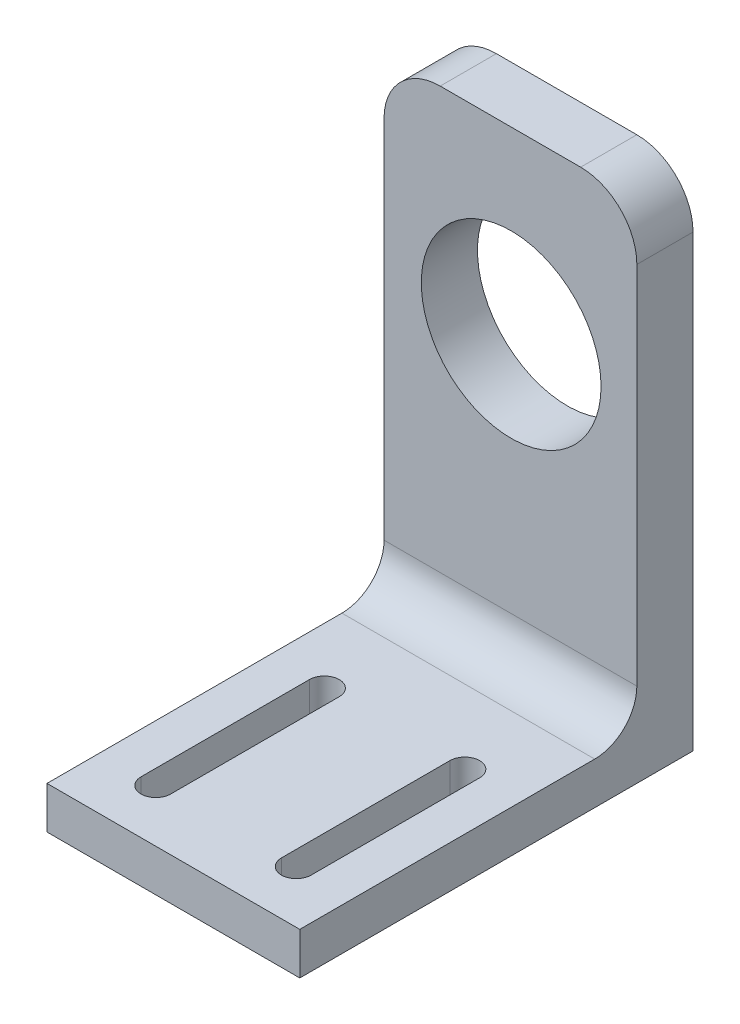
ISO-10303-21;
HEADER;
FILE_DESCRIPTION(('STEP AP214'),'2;1');
FILE_NAME('part.step','',(''),(''),'','','');
FILE_SCHEMA(('AUTOMOTIVE_DESIGN { 1 0 10303 214 1 1 1 1 }'));
ENDSEC;
DATA;
#1=APPLICATION_CONTEXT('core data for automotive mechanical design processes');
#2=APPLICATION_PROTOCOL_DEFINITION('international standard','automotive_design',2000,#1);
#3=PRODUCT_CONTEXT('',#1,'mechanical');
#4=PRODUCT('Part','Part','',(#3));
#5=PRODUCT_RELATED_PRODUCT_CATEGORY('part','',(#4));
#6=PRODUCT_DEFINITION_FORMATION('','',#4);
#7=PRODUCT_DEFINITION_CONTEXT('part definition',#1,'design');
#8=PRODUCT_DEFINITION('design','',#6,#7);
#9=PRODUCT_DEFINITION_SHAPE('','',#8);
#10=(LENGTH_UNIT() NAMED_UNIT(*) SI_UNIT(.MILLI.,.METRE.));
#11=(NAMED_UNIT(*) PLANE_ANGLE_UNIT() SI_UNIT($,.RADIAN.));
#12=(NAMED_UNIT(*) SI_UNIT($,.STERADIAN.) SOLID_ANGLE_UNIT());
#13=UNCERTAINTY_MEASURE_WITH_UNIT(LENGTH_MEASURE(1.E-05),#10,'distance_accuracy_value','');
#14=(GEOMETRIC_REPRESENTATION_CONTEXT(3) GLOBAL_UNCERTAINTY_ASSIGNED_CONTEXT((#13)) GLOBAL_UNIT_ASSIGNED_CONTEXT((#10,
#11,#12)) REPRESENTATION_CONTEXT('',''));
#15=CARTESIAN_POINT('',(0.,0.,0.));
#16=DIRECTION('',(0.,0.,1.));
#17=DIRECTION('',(1.,0.,0.));
#18=AXIS2_PLACEMENT_3D('',#15,#16,#17);
#19=CARTESIAN_POINT('',(22.5,45.,10.));
#20=DIRECTION('',(-1.,0.,0.));
#21=DIRECTION('',(0.,0.,1.));
#22=AXIS2_PLACEMENT_3D('',#19,#20,#21);
#23=PLANE('',#22);
#24=DIRECTION('',(0.,1.,0.));
#25=VECTOR('',#24,1.);
#26=CARTESIAN_POINT('',(22.5,45.,0.));
#27=LINE('',#26,#25);
#28=CARTESIAN_POINT('',(22.5,-45.,0.));
#29=VERTEX_POINT('',#28);
#30=CARTESIAN_POINT('',(22.5,35.,0.));
#31=VERTEX_POINT('',#30);
#32=EDGE_CURVE('E281',#29,#31,#27,.T.);
#33=ORIENTED_EDGE('',*,*,#32,.T.);
#34=DIRECTION('',(0.,0.,-1.));
#35=VECTOR('',#34,1.);
#36=CARTESIAN_POINT('',(22.5,35.,10.));
#37=LINE('',#36,#35);
#38=CARTESIAN_POINT('',(22.5,35.,10.));
#39=VERTEX_POINT('',#38);
#40=EDGE_CURVE('E327',#31,#39,#37,.F.);
#41=ORIENTED_EDGE('',*,*,#40,.T.);
#42=DIRECTION('',(0.,1.,0.));
#43=VECTOR('',#42,1.);
#44=CARTESIAN_POINT('',(22.5,45.,10.));
#45=LINE('',#44,#43);
#46=CARTESIAN_POINT('',(22.5,-30.,10.));
#47=VERTEX_POINT('',#46);
#48=EDGE_CURVE('E282',#47,#39,#45,.T.);
#49=ORIENTED_EDGE('',*,*,#48,.F.);
#50=CARTESIAN_POINT('',(22.5,-30.,17.5));
#51=DIRECTION('',(-1.,0.,0.));
#52=DIRECTION('',(0.,0.,1.));
#53=AXIS2_PLACEMENT_3D('',#50,#51,#52);
#54=CIRCLE('',#53,7.5);
#55=CARTESIAN_POINT('',(22.5,-37.5,17.5));
#56=VERTEX_POINT('',#55);
#57=EDGE_CURVE('E11',#47,#56,#54,.T.);
#58=ORIENTED_EDGE('',*,*,#57,.T.);
#59=DIRECTION('',(0.,0.,-1.));
#60=VECTOR('',#59,1.);
#61=CARTESIAN_POINT('',(22.5,-37.5,70.));
#62=LINE('',#61,#60);
#63=CARTESIAN_POINT('',(22.5,-37.5,70.));
#64=VERTEX_POINT('',#63);
#65=EDGE_CURVE('E269',#64,#56,#62,.T.);
#66=ORIENTED_EDGE('',*,*,#65,.F.);
#67=DIRECTION('',(0.,1.,0.));
#68=VECTOR('',#67,1.);
#69=CARTESIAN_POINT('',(22.5,-37.5,70.));
#70=LINE('',#69,#68);
#71=CARTESIAN_POINT('',(22.5,-45.,70.));
#72=VERTEX_POINT('',#71);
#73=EDGE_CURVE('E259',#72,#64,#70,.T.);
#74=ORIENTED_EDGE('',*,*,#73,.F.);
#75=DIRECTION('',(0.,0.,-1.));
#76=VECTOR('',#75,1.);
#77=CARTESIAN_POINT('',(22.5,-45.,10.));
#78=LINE('',#77,#76);
#79=EDGE_CURVE('E294',#72,#29,#78,.T.);
#80=ORIENTED_EDGE('',*,*,#79,.T.);
#81=EDGE_LOOP('',(#33,#41,#49,#58,#66,#74,#80));
#82=FACE_BOUND('',#81,.T.);
#83=ADVANCED_FACE('F39',(#82),#23,.F.);
#84=CARTESIAN_POINT('',(-22.5,45.,10.));
#85=DIRECTION('',(0.,-1.,0.));
#86=DIRECTION('',(0.,0.,-1.));
#87=AXIS2_PLACEMENT_3D('',#84,#85,#86);
#88=PLANE('',#87);
#89=DIRECTION('',(-1.,0.,0.));
#90=VECTOR('',#89,1.);
#91=CARTESIAN_POINT('',(-22.5,45.,10.));
#92=LINE('',#91,#90);
#93=CARTESIAN_POINT('',(12.5,45.,10.));
#94=VERTEX_POINT('',#93);
#95=CARTESIAN_POINT('',(-12.5,45.,10.));
#96=VERTEX_POINT('',#95);
#97=EDGE_CURVE('E285',#94,#96,#92,.T.);
#98=ORIENTED_EDGE('',*,*,#97,.F.);
#99=DIRECTION('',(0.,0.,-1.));
#100=VECTOR('',#99,1.);
#101=CARTESIAN_POINT('',(12.5,45.,10.));
#102=LINE('',#101,#100);
#103=CARTESIAN_POINT('',(12.5,45.,0.));
#104=VERTEX_POINT('',#103);
#105=EDGE_CURVE('E317',#94,#104,#102,.T.);
#106=ORIENTED_EDGE('',*,*,#105,.T.);
#107=DIRECTION('',(-1.,0.,0.));
#108=VECTOR('',#107,1.);
#109=CARTESIAN_POINT('',(-22.5,45.,0.));
#110=LINE('',#109,#108);
#111=CARTESIAN_POINT('',(-12.5,45.,0.));
#112=VERTEX_POINT('',#111);
#113=EDGE_CURVE('E298',#104,#112,#110,.T.);
#114=ORIENTED_EDGE('',*,*,#113,.T.);
#115=DIRECTION('',(0.,0.,-1.));
#116=VECTOR('',#115,1.);
#117=CARTESIAN_POINT('',(-12.5,45.,10.));
#118=LINE('',#117,#116);
#119=EDGE_CURVE('E314',#112,#96,#118,.F.);
#120=ORIENTED_EDGE('',*,*,#119,.T.);
#121=EDGE_LOOP('',(#98,#106,#114,#120));
#122=FACE_BOUND('',#121,.T.);
#123=ADVANCED_FACE('F385',(#122),#88,.F.);
#124=CARTESIAN_POINT('',(-22.5,45.,10.));
#125=DIRECTION('',(1.,0.,0.));
#126=DIRECTION('',(0.,0.,-1.));
#127=AXIS2_PLACEMENT_3D('',#124,#125,#126);
#128=PLANE('',#127);
#129=DIRECTION('',(0.,-1.,0.));
#130=VECTOR('',#129,1.);
#131=CARTESIAN_POINT('',(-22.5,45.,10.));
#132=LINE('',#131,#130);
#133=CARTESIAN_POINT('',(-22.5,35.,10.));
#134=VERTEX_POINT('',#133);
#135=CARTESIAN_POINT('',(-22.5,-30.,10.));
#136=VERTEX_POINT('',#135);
#137=EDGE_CURVE('E290',#134,#136,#132,.T.);
#138=ORIENTED_EDGE('',*,*,#137,.F.);
#139=DIRECTION('',(0.,0.,-1.));
#140=VECTOR('',#139,1.);
#141=CARTESIAN_POINT('',(-22.5,35.,10.));
#142=LINE('',#141,#140);
#143=CARTESIAN_POINT('',(-22.5,35.,0.));
#144=VERTEX_POINT('',#143);
#145=EDGE_CURVE('E337',#134,#144,#142,.T.);
#146=ORIENTED_EDGE('',*,*,#145,.T.);
#147=DIRECTION('',(0.,-1.,0.));
#148=VECTOR('',#147,1.);
#149=CARTESIAN_POINT('',(-22.5,45.,0.));
#150=LINE('',#149,#148);
#151=CARTESIAN_POINT('',(-22.5,-45.,0.));
#152=VERTEX_POINT('',#151);
#153=EDGE_CURVE('E302',#144,#152,#150,.T.);
#154=ORIENTED_EDGE('',*,*,#153,.T.);
#155=DIRECTION('',(0.,0.,-1.));
#156=VECTOR('',#155,1.);
#157=CARTESIAN_POINT('',(-22.5,-45.,10.));
#158=LINE('',#157,#156);
#159=CARTESIAN_POINT('',(-22.5,-45.,70.));
#160=VERTEX_POINT('',#159);
#161=EDGE_CURVE('E310',#160,#152,#158,.T.);
#162=ORIENTED_EDGE('',*,*,#161,.F.);
#163=DIRECTION('',(0.,-1.,0.));
#164=VECTOR('',#163,1.);
#165=CARTESIAN_POINT('',(-22.5,-37.5,70.));
#166=LINE('',#165,#164);
#167=CARTESIAN_POINT('',(-22.5,-37.5,70.));
#168=VERTEX_POINT('',#167);
#169=EDGE_CURVE('E251',#168,#160,#166,.T.);
#170=ORIENTED_EDGE('',*,*,#169,.F.);
#171=DIRECTION('',(0.,0.,-1.));
#172=VECTOR('',#171,1.);
#173=CARTESIAN_POINT('',(-22.5,-37.5,70.));
#174=LINE('',#173,#172);
#175=CARTESIAN_POINT('',(-22.5,-37.5,17.5));
#176=VERTEX_POINT('',#175);
#177=EDGE_CURVE('E265',#168,#176,#174,.T.);
#178=ORIENTED_EDGE('',*,*,#177,.T.);
#179=CARTESIAN_POINT('',(-22.5,-30.,17.5));
#180=DIRECTION('',(1.,0.,0.));
#181=DIRECTION('',(0.,0.,-1.));
#182=AXIS2_PLACEMENT_3D('',#179,#180,#181);
#183=CIRCLE('',#182,7.5);
#184=EDGE_CURVE('E48',#176,#136,#183,.T.);
#185=ORIENTED_EDGE('',*,*,#184,.T.);
#186=EDGE_LOOP('',(#138,#146,#154,#162,#170,#178,#185));
#187=FACE_BOUND('',#186,.T.);
#188=ADVANCED_FACE('F350',(#187),#128,.F.);
#189=CARTESIAN_POINT('',(-22.5,-45.,10.));
#190=DIRECTION('',(0.,1.,0.));
#191=DIRECTION('',(0.,0.,1.));
#192=AXIS2_PLACEMENT_3D('',#189,#190,#191);
#193=PLANE('',#192);
#194=DIRECTION('',(0.,0.,-1.));
#195=VECTOR('',#194,1.);
#196=CARTESIAN_POINT('',(-9.85000000000001,-45.,9.99999999999999));
#197=LINE('',#196,#195);
#198=CARTESIAN_POINT('',(-9.84999999999998,-45.,60.625));
#199=VERTEX_POINT('',#198);
#200=CARTESIAN_POINT('',(-9.85,-45.,30.625));
#201=VERTEX_POINT('',#200);
#202=EDGE_CURVE('E243',#199,#201,#197,.T.);
#203=ORIENTED_EDGE('',*,*,#202,.T.);
#204=CARTESIAN_POINT('',(-12.5,-45.,30.625));
#205=DIRECTION('',(0.,1.,0.));
#206=DIRECTION('',(0.,0.,1.));
#207=AXIS2_PLACEMENT_3D('',#204,#205,#206);
#208=CIRCLE('',#207,2.65);
#209=CARTESIAN_POINT('',(-15.15,-45.,30.625));
#210=VERTEX_POINT('',#209);
#211=EDGE_CURVE('E247',#201,#210,#208,.T.);
#212=ORIENTED_EDGE('',*,*,#211,.T.);
#213=DIRECTION('',(0.,0.,1.));
#214=VECTOR('',#213,1.);
#215=CARTESIAN_POINT('',(-15.15,-45.,10.));
#216=LINE('',#215,#214);
#217=CARTESIAN_POINT('',(-15.15,-45.,60.625));
#218=VERTEX_POINT('',#217);
#219=EDGE_CURVE('E238',#210,#218,#216,.T.);
#220=ORIENTED_EDGE('',*,*,#219,.T.);
#221=CARTESIAN_POINT('',(-12.5,-45.,60.625));
#222=DIRECTION('',(0.,1.,0.));
#223=DIRECTION('',(0.,0.,1.));
#224=AXIS2_PLACEMENT_3D('',#221,#222,#223);
#225=CIRCLE('',#224,2.65);
#226=EDGE_CURVE('E163',#218,#199,#225,.T.);
#227=ORIENTED_EDGE('',*,*,#226,.T.);
#228=EDGE_LOOP('',(#203,#212,#220,#227));
#229=FACE_BOUND('',#228,.T.);
#230=DIRECTION('',(0.,0.,-1.));
#231=VECTOR('',#230,1.);
#232=CARTESIAN_POINT('',(15.1499999999998,-45.,9.99999999999959));
#233=LINE('',#232,#231);
#234=CARTESIAN_POINT('',(15.15,-45.,60.625));
#235=VERTEX_POINT('',#234);
#236=CARTESIAN_POINT('',(15.15,-45.,30.625));
#237=VERTEX_POINT('',#236);
#238=EDGE_CURVE('E230',#235,#237,#233,.T.);
#239=ORIENTED_EDGE('',*,*,#238,.T.);
#240=CARTESIAN_POINT('',(12.5,-45.,30.625));
#241=DIRECTION('',(0.,1.,0.));
#242=DIRECTION('',(0.,0.,1.));
#243=AXIS2_PLACEMENT_3D('',#240,#241,#242);
#244=CIRCLE('',#243,2.65);
#245=CARTESIAN_POINT('',(9.85,-45.,30.625));
#246=VERTEX_POINT('',#245);
#247=EDGE_CURVE('E234',#237,#246,#244,.T.);
#248=ORIENTED_EDGE('',*,*,#247,.T.);
#249=DIRECTION('',(0.,0.,1.));
#250=VECTOR('',#249,1.);
#251=CARTESIAN_POINT('',(9.84999999999978,-45.,9.99999999999965));
#252=LINE('',#251,#250);
#253=CARTESIAN_POINT('',(9.85000000000033,-45.,60.625));
#254=VERTEX_POINT('',#253);
#255=EDGE_CURVE('E192',#246,#254,#252,.T.);
#256=ORIENTED_EDGE('',*,*,#255,.T.);
#257=CARTESIAN_POINT('',(12.5,-45.,60.625));
#258=DIRECTION('',(0.,1.,0.));
#259=DIRECTION('',(0.,0.,1.));
#260=AXIS2_PLACEMENT_3D('',#257,#258,#259);
#261=CIRCLE('',#260,2.65);
#262=EDGE_CURVE('E226',#254,#235,#261,.T.);
#263=ORIENTED_EDGE('',*,*,#262,.T.);
#264=EDGE_LOOP('',(#239,#248,#256,#263));
#265=FACE_BOUND('',#264,.T.);
#266=DIRECTION('',(1.,0.,0.));
#267=VECTOR('',#266,1.);
#268=CARTESIAN_POINT('',(-22.5,-45.,0.));
#269=LINE('',#268,#267);
#270=EDGE_CURVE('E286',#152,#29,#269,.T.);
#271=ORIENTED_EDGE('',*,*,#270,.T.);
#272=ORIENTED_EDGE('',*,*,#79,.F.);
#273=DIRECTION('',(1.,0.,0.));
#274=VECTOR('',#273,1.);
#275=CARTESIAN_POINT('',(-22.5,-45.,70.));
#276=LINE('',#275,#274);
#277=EDGE_CURVE('E255',#160,#72,#276,.T.);
#278=ORIENTED_EDGE('',*,*,#277,.F.);
#279=ORIENTED_EDGE('',*,*,#161,.T.);
#280=EDGE_LOOP('',(#271,#272,#278,#279));
#281=FACE_BOUND('',#280,.T.);
#282=ADVANCED_FACE('F389',(#229,#265,#281),#193,.F.);
#283=CARTESIAN_POINT('',(0.,0.,10.));
#284=DIRECTION('',(0.,0.,1.));
#285=DIRECTION('',(1.,0.,0.));
#286=AXIS2_PLACEMENT_3D('',#283,#284,#285);
#287=PLANE('',#286);
#288=ORIENTED_EDGE('',*,*,#137,.T.);
#289=DIRECTION('',(-1.,0.,0.));
#290=VECTOR('',#289,1.);
#291=CARTESIAN_POINT('',(0.,-30.,10.));
#292=LINE('',#291,#290);
#293=EDGE_CURVE('E345',#136,#47,#292,.F.);
#294=ORIENTED_EDGE('',*,*,#293,.T.);
#295=ORIENTED_EDGE('',*,*,#48,.T.);
#296=CARTESIAN_POINT('',(12.5,35.,10.));
#297=DIRECTION('',(0.,0.,1.));
#298=DIRECTION('',(1.,0.,0.));
#299=AXIS2_PLACEMENT_3D('',#296,#297,#298);
#300=CIRCLE('',#299,10.);
#301=EDGE_CURVE('E334',#39,#94,#300,.T.);
#302=ORIENTED_EDGE('',*,*,#301,.T.);
#303=ORIENTED_EDGE('',*,*,#97,.T.);
#304=CARTESIAN_POINT('',(-12.5,35.,10.));
#305=DIRECTION('',(0.,0.,1.));
#306=DIRECTION('',(1.,0.,0.));
#307=AXIS2_PLACEMENT_3D('',#304,#305,#306);
#308=CIRCLE('',#307,10.);
#309=EDGE_CURVE('E331',#96,#134,#308,.T.);
#310=ORIENTED_EDGE('',*,*,#309,.T.);
#311=EDGE_LOOP('',(#288,#294,#295,#302,#303,#310));
#312=FACE_BOUND('',#311,.T.);
#313=CARTESIAN_POINT('',(0.129474068756216,13.0054809807068,10.));
#314=DIRECTION('',(0.,0.,1.));
#315=DIRECTION('',(1.,0.,0.));
#316=AXIS2_PLACEMENT_3D('',#313,#314,#315);
#317=CIRCLE('',#316,16.);
#318=CARTESIAN_POINT('',(16.1294740687562,13.0054809807068,10.));
#319=VERTEX_POINT('',#318);
#320=EDGE_CURVE('E277',#319,#319,#317,.F.);
#321=ORIENTED_EDGE('',*,*,#320,.T.);
#322=EDGE_LOOP('',(#321));
#323=FACE_BOUND('',#322,.T.);
#324=ADVANCED_FACE('F358',(#312,#323),#287,.T.);
#325=CARTESIAN_POINT('',(0.,0.,0.));
#326=DIRECTION('',(0.,0.,1.));
#327=DIRECTION('',(1.,0.,0.));
#328=AXIS2_PLACEMENT_3D('',#325,#326,#327);
#329=PLANE('',#328);
#330=CARTESIAN_POINT('',(0.129474068756216,13.0054809807068,0.));
#331=DIRECTION('',(0.,0.,1.));
#332=DIRECTION('',(1.,0.,0.));
#333=AXIS2_PLACEMENT_3D('',#330,#331,#332);
#334=CIRCLE('',#333,16.);
#335=CARTESIAN_POINT('',(16.1294740687562,13.0054809807068,0.));
#336=VERTEX_POINT('',#335);
#337=EDGE_CURVE('E273',#336,#336,#334,.T.);
#338=ORIENTED_EDGE('',*,*,#337,.T.);
#339=EDGE_LOOP('',(#338));
#340=FACE_BOUND('',#339,.T.);
#341=ORIENTED_EDGE('',*,*,#113,.F.);
#342=CARTESIAN_POINT('',(12.5,35.,0.));
#343=DIRECTION('',(0.,0.,1.));
#344=DIRECTION('',(1.,0.,0.));
#345=AXIS2_PLACEMENT_3D('',#342,#343,#344);
#346=CIRCLE('',#345,10.);
#347=EDGE_CURVE('E324',#104,#31,#346,.F.);
#348=ORIENTED_EDGE('',*,*,#347,.T.);
#349=ORIENTED_EDGE('',*,*,#32,.F.);
#350=ORIENTED_EDGE('',*,*,#270,.F.);
#351=ORIENTED_EDGE('',*,*,#153,.F.);
#352=CARTESIAN_POINT('',(-12.5,35.,0.));
#353=DIRECTION('',(0.,0.,1.));
#354=DIRECTION('',(1.,0.,0.));
#355=AXIS2_PLACEMENT_3D('',#352,#353,#354);
#356=CIRCLE('',#355,10.);
#357=EDGE_CURVE('E321',#144,#112,#356,.F.);
#358=ORIENTED_EDGE('',*,*,#357,.T.);
#359=EDGE_LOOP('',(#341,#348,#349,#350,#351,#358));
#360=FACE_BOUND('',#359,.T.);
#361=ADVANCED_FACE('F377',(#340,#360),#329,.F.);
#362=CARTESIAN_POINT('',(0.129474068756216,13.0054809807068,28.));
#363=DIRECTION('',(0.,0.,-1.));
#364=DIRECTION('',(-1.,0.,0.));
#365=AXIS2_PLACEMENT_3D('',#362,#363,#364);
#366=CYLINDRICAL_SURFACE('',#365,16.);
#367=ORIENTED_EDGE('',*,*,#320,.F.);
#368=EDGE_LOOP('',(#367));
#369=FACE_BOUND('',#368,.T.);
#370=ORIENTED_EDGE('',*,*,#337,.F.);
#371=EDGE_LOOP('',(#370));
#372=FACE_BOUND('',#371,.T.);
#373=ADVANCED_FACE('F409',(#369,#372),#366,.F.);
#374=CARTESIAN_POINT('',(12.5,35.,10.));
#375=DIRECTION('',(0.,0.,-1.));
#376=DIRECTION('',(-1.,0.,0.));
#377=AXIS2_PLACEMENT_3D('',#374,#375,#376);
#378=CYLINDRICAL_SURFACE('',#377,10.);
#379=ORIENTED_EDGE('',*,*,#301,.F.);
#380=ORIENTED_EDGE('',*,*,#40,.F.);
#381=ORIENTED_EDGE('',*,*,#347,.F.);
#382=ORIENTED_EDGE('',*,*,#105,.F.);
#383=EDGE_LOOP('',(#379,#380,#381,#382));
#384=FACE_BOUND('',#383,.T.);
#385=ADVANCED_FACE('F382',(#384),#378,.T.);
#386=CARTESIAN_POINT('',(-12.5,35.,10.));
#387=DIRECTION('',(0.,0.,-1.));
#388=DIRECTION('',(-1.,0.,0.));
#389=AXIS2_PLACEMENT_3D('',#386,#387,#388);
#390=CYLINDRICAL_SURFACE('',#389,10.);
#391=ORIENTED_EDGE('',*,*,#309,.F.);
#392=ORIENTED_EDGE('',*,*,#119,.F.);
#393=ORIENTED_EDGE('',*,*,#357,.F.);
#394=ORIENTED_EDGE('',*,*,#145,.F.);
#395=EDGE_LOOP('',(#391,#392,#393,#394));
#396=FACE_BOUND('',#395,.T.);
#397=ADVANCED_FACE('F388',(#396),#390,.T.);
#398=CARTESIAN_POINT('',(-22.5,-37.5,70.));
#399=DIRECTION('',(0.,-1.,0.));
#400=DIRECTION('',(0.,0.,-1.));
#401=AXIS2_PLACEMENT_3D('',#398,#399,#400);
#402=PLANE('',#401);
#403=DIRECTION('',(0.,0.,1.));
#404=VECTOR('',#403,1.);
#405=CARTESIAN_POINT('',(-15.15,-37.5,30.625));
#406=LINE('',#405,#404);
#407=CARTESIAN_POINT('',(-15.15,-37.5,30.625));
#408=VERTEX_POINT('',#407);
#409=CARTESIAN_POINT('',(-15.15,-37.5,60.625));
#410=VERTEX_POINT('',#409);
#411=EDGE_CURVE('E171',#408,#410,#406,.T.);
#412=ORIENTED_EDGE('',*,*,#411,.F.);
#413=CARTESIAN_POINT('',(-12.5,-37.5,30.625));
#414=DIRECTION('',(0.,1.,0.));
#415=DIRECTION('',(0.,0.,1.));
#416=AXIS2_PLACEMENT_3D('',#413,#414,#415);
#417=CIRCLE('',#416,2.65);
#418=CARTESIAN_POINT('',(-9.85,-37.5,30.625));
#419=VERTEX_POINT('',#418);
#420=EDGE_CURVE('E177',#419,#408,#417,.T.);
#421=ORIENTED_EDGE('',*,*,#420,.F.);
#422=DIRECTION('',(0.,0.,-1.));
#423=VECTOR('',#422,1.);
#424=CARTESIAN_POINT('',(-9.85,-37.5,30.625));
#425=LINE('',#424,#423);
#426=CARTESIAN_POINT('',(-9.84999999999998,-37.5,60.625));
#427=VERTEX_POINT('',#426);
#428=EDGE_CURVE('E182',#427,#419,#425,.T.);
#429=ORIENTED_EDGE('',*,*,#428,.F.);
#430=CARTESIAN_POINT('',(-12.5,-37.5,60.625));
#431=DIRECTION('',(0.,1.,0.));
#432=DIRECTION('',(0.,0.,1.));
#433=AXIS2_PLACEMENT_3D('',#430,#431,#432);
#434=CIRCLE('',#433,2.65);
#435=EDGE_CURVE('E160',#410,#427,#434,.T.);
#436=ORIENTED_EDGE('',*,*,#435,.F.);
#437=EDGE_LOOP('',(#412,#421,#429,#436));
#438=FACE_BOUND('',#437,.T.);
#439=DIRECTION('',(0.,0.,1.));
#440=VECTOR('',#439,1.);
#441=CARTESIAN_POINT('',(9.85,-37.5,30.625));
#442=LINE('',#441,#440);
#443=CARTESIAN_POINT('',(9.85,-37.5,30.625));
#444=VERTEX_POINT('',#443);
#445=CARTESIAN_POINT('',(9.85000000000032,-37.5,60.625));
#446=VERTEX_POINT('',#445);
#447=EDGE_CURVE('E200',#444,#446,#442,.T.);
#448=ORIENTED_EDGE('',*,*,#447,.F.);
#449=CARTESIAN_POINT('',(12.5,-37.5,30.625));
#450=DIRECTION('',(0.,1.,0.));
#451=DIRECTION('',(0.,0.,-1.));
#452=AXIS2_PLACEMENT_3D('',#449,#450,#451);
#453=CIRCLE('',#452,2.65);
#454=CARTESIAN_POINT('',(15.15,-37.5,30.625));
#455=VERTEX_POINT('',#454);
#456=EDGE_CURVE('E197',#455,#444,#453,.T.);
#457=ORIENTED_EDGE('',*,*,#456,.F.);
#458=DIRECTION('',(0.,0.,-1.));
#459=VECTOR('',#458,1.);
#460=CARTESIAN_POINT('',(15.15,-37.5,30.625));
#461=LINE('',#460,#459);
#462=CARTESIAN_POINT('',(15.15,-37.5,60.625));
#463=VERTEX_POINT('',#462);
#464=EDGE_CURVE('E207',#463,#455,#461,.T.);
#465=ORIENTED_EDGE('',*,*,#464,.F.);
#466=CARTESIAN_POINT('',(12.5,-37.5,60.625));
#467=DIRECTION('',(0.,1.,0.));
#468=DIRECTION('',(0.,0.,-1.));
#469=AXIS2_PLACEMENT_3D('',#466,#467,#468);
#470=CIRCLE('',#469,2.65);
#471=EDGE_CURVE('E203',#446,#463,#470,.T.);
#472=ORIENTED_EDGE('',*,*,#471,.F.);
#473=EDGE_LOOP('',(#448,#457,#465,#472));
#474=FACE_BOUND('',#473,.T.);
#475=ORIENTED_EDGE('',*,*,#65,.T.);
#476=DIRECTION('',(-1.,0.,0.));
#477=VECTOR('',#476,1.);
#478=CARTESIAN_POINT('',(-22.5,-37.5,17.5));
#479=LINE('',#478,#477);
#480=EDGE_CURVE('E341',#56,#176,#479,.T.);
#481=ORIENTED_EDGE('',*,*,#480,.T.);
#482=ORIENTED_EDGE('',*,*,#177,.F.);
#483=DIRECTION('',(-1.,0.,0.));
#484=VECTOR('',#483,1.);
#485=CARTESIAN_POINT('',(-22.5,-37.5,70.));
#486=LINE('',#485,#484);
#487=EDGE_CURVE('E262',#64,#168,#486,.T.);
#488=ORIENTED_EDGE('',*,*,#487,.F.);
#489=EDGE_LOOP('',(#475,#481,#482,#488));
#490=FACE_BOUND('',#489,.T.);
#491=ADVANCED_FACE('F179',(#438,#474,#490),#402,.F.);
#492=CARTESIAN_POINT('',(0.,0.,70.));
#493=DIRECTION('',(0.,0.,1.));
#494=DIRECTION('',(1.,0.,0.));
#495=AXIS2_PLACEMENT_3D('',#492,#493,#494);
#496=PLANE('',#495);
#497=ORIENTED_EDGE('',*,*,#169,.T.);
#498=ORIENTED_EDGE('',*,*,#277,.T.);
#499=ORIENTED_EDGE('',*,*,#73,.T.);
#500=ORIENTED_EDGE('',*,*,#487,.T.);
#501=EDGE_LOOP('',(#497,#498,#499,#500));
#502=FACE_BOUND('',#501,.T.);
#503=ADVANCED_FACE('F369',(#502),#496,.T.);
#504=CARTESIAN_POINT('',(-22.5,-30.,17.5));
#505=DIRECTION('',(-1.,0.,0.));
#506=DIRECTION('',(0.,0.,1.));
#507=AXIS2_PLACEMENT_3D('',#504,#505,#506);
#508=CYLINDRICAL_SURFACE('',#507,7.5);
#509=ORIENTED_EDGE('',*,*,#57,.F.);
#510=ORIENTED_EDGE('',*,*,#293,.F.);
#511=ORIENTED_EDGE('',*,*,#184,.F.);
#512=ORIENTED_EDGE('',*,*,#480,.F.);
#513=EDGE_LOOP('',(#509,#510,#511,#512));
#514=FACE_BOUND('',#513,.T.);
#515=ADVANCED_FACE('F41',(#514),#508,.F.);
#516=CARTESIAN_POINT('',(12.5,-47.5,30.625));
#517=DIRECTION('',(0.,1.,0.));
#518=DIRECTION('',(0.,0.,1.));
#519=AXIS2_PLACEMENT_3D('',#516,#517,#518);
#520=CYLINDRICAL_SURFACE('',#519,2.65);
#521=DIRECTION('',(0.,1.,0.));
#522=VECTOR('',#521,1.);
#523=CARTESIAN_POINT('',(15.15,-47.5,30.625));
#524=LINE('',#523,#522);
#525=EDGE_CURVE('E212',#237,#455,#524,.T.);
#526=ORIENTED_EDGE('',*,*,#525,.T.);
#527=ORIENTED_EDGE('',*,*,#456,.T.);
#528=DIRECTION('',(0.,1.,0.));
#529=VECTOR('',#528,1.);
#530=CARTESIAN_POINT('',(9.85,-47.5,30.625));
#531=LINE('',#530,#529);
#532=EDGE_CURVE('E211',#246,#444,#531,.T.);
#533=ORIENTED_EDGE('',*,*,#532,.F.);
#534=ORIENTED_EDGE('',*,*,#247,.F.);
#535=EDGE_LOOP('',(#526,#527,#533,#534));
#536=FACE_BOUND('',#535,.T.);
#537=ADVANCED_FACE('F477',(#536),#520,.F.);
#538=CARTESIAN_POINT('',(15.15,-47.5,30.625));
#539=DIRECTION('',(1.,0.,0.));
#540=DIRECTION('',(0.,0.,-1.));
#541=AXIS2_PLACEMENT_3D('',#538,#539,#540);
#542=PLANE('',#541);
#543=DIRECTION('',(0.,1.,0.));
#544=VECTOR('',#543,1.);
#545=CARTESIAN_POINT('',(15.15,-47.5,60.625));
#546=LINE('',#545,#544);
#547=EDGE_CURVE('E215',#235,#463,#546,.T.);
#548=ORIENTED_EDGE('',*,*,#547,.T.);
#549=ORIENTED_EDGE('',*,*,#464,.T.);
#550=ORIENTED_EDGE('',*,*,#525,.F.);
#551=ORIENTED_EDGE('',*,*,#238,.F.);
#552=EDGE_LOOP('',(#548,#549,#550,#551));
#553=FACE_BOUND('',#552,.T.);
#554=ADVANCED_FACE('F492',(#553),#542,.F.);
#555=CARTESIAN_POINT('',(12.5,-47.5,60.625));
#556=DIRECTION('',(0.,1.,0.));
#557=DIRECTION('',(0.,0.,1.));
#558=AXIS2_PLACEMENT_3D('',#555,#556,#557);
#559=CYLINDRICAL_SURFACE('',#558,2.65);
#560=DIRECTION('',(0.,1.,0.));
#561=VECTOR('',#560,1.);
#562=CARTESIAN_POINT('',(9.85000000000032,-47.5,60.625));
#563=LINE('',#562,#561);
#564=EDGE_CURVE('E63',#254,#446,#563,.T.);
#565=ORIENTED_EDGE('',*,*,#564,.T.);
#566=ORIENTED_EDGE('',*,*,#471,.T.);
#567=ORIENTED_EDGE('',*,*,#547,.F.);
#568=ORIENTED_EDGE('',*,*,#262,.F.);
#569=EDGE_LOOP('',(#565,#566,#567,#568));
#570=FACE_BOUND('',#569,.T.);
#571=ADVANCED_FACE('F501',(#570),#559,.F.);
#572=CARTESIAN_POINT('',(9.85,-47.5,30.625));
#573=DIRECTION('',(-1.,0.,0.));
#574=DIRECTION('',(0.,0.,1.));
#575=AXIS2_PLACEMENT_3D('',#572,#573,#574);
#576=PLANE('',#575);
#577=ORIENTED_EDGE('',*,*,#532,.T.);
#578=ORIENTED_EDGE('',*,*,#447,.T.);
#579=ORIENTED_EDGE('',*,*,#564,.F.);
#580=ORIENTED_EDGE('',*,*,#255,.F.);
#581=EDGE_LOOP('',(#577,#578,#579,#580));
#582=FACE_BOUND('',#581,.T.);
#583=ADVANCED_FACE('F511',(#582),#576,.F.);
#584=CARTESIAN_POINT('',(-12.5,-47.5,30.625));
#585=DIRECTION('',(0.,1.,0.));
#586=DIRECTION('',(0.,0.,1.));
#587=AXIS2_PLACEMENT_3D('',#584,#585,#586);
#588=CYLINDRICAL_SURFACE('',#587,2.65);
#589=DIRECTION('',(0.,1.,0.));
#590=VECTOR('',#589,1.);
#591=CARTESIAN_POINT('',(-9.85,-47.5,30.625));
#592=LINE('',#591,#590);
#593=EDGE_CURVE('E189',#201,#419,#592,.T.);
#594=ORIENTED_EDGE('',*,*,#593,.T.);
#595=ORIENTED_EDGE('',*,*,#420,.T.);
#596=DIRECTION('',(0.,1.,0.));
#597=VECTOR('',#596,1.);
#598=CARTESIAN_POINT('',(-15.15,-47.5,30.625));
#599=LINE('',#598,#597);
#600=EDGE_CURVE('E167',#210,#408,#599,.T.);
#601=ORIENTED_EDGE('',*,*,#600,.F.);
#602=ORIENTED_EDGE('',*,*,#211,.F.);
#603=EDGE_LOOP('',(#594,#595,#601,#602));
#604=FACE_BOUND('',#603,.T.);
#605=ADVANCED_FACE('F521',(#604),#588,.F.);
#606=CARTESIAN_POINT('',(-9.85,-47.5,30.625));
#607=DIRECTION('',(1.,0.,0.));
#608=DIRECTION('',(0.,0.,-1.));
#609=AXIS2_PLACEMENT_3D('',#606,#607,#608);
#610=PLANE('',#609);
#611=DIRECTION('',(0.,1.,0.));
#612=VECTOR('',#611,1.);
#613=CARTESIAN_POINT('',(-9.84999999999998,-47.5,60.625));
#614=LINE('',#613,#612);
#615=EDGE_CURVE('E166',#199,#427,#614,.T.);
#616=ORIENTED_EDGE('',*,*,#615,.T.);
#617=ORIENTED_EDGE('',*,*,#428,.T.);
#618=ORIENTED_EDGE('',*,*,#593,.F.);
#619=ORIENTED_EDGE('',*,*,#202,.F.);
#620=EDGE_LOOP('',(#616,#617,#618,#619));
#621=FACE_BOUND('',#620,.T.);
#622=ADVANCED_FACE('F530',(#621),#610,.F.);
#623=CARTESIAN_POINT('',(-12.5,-47.5,60.625));
#624=DIRECTION('',(0.,1.,0.));
#625=DIRECTION('',(0.,0.,1.));
#626=AXIS2_PLACEMENT_3D('',#623,#624,#625);
#627=CYLINDRICAL_SURFACE('',#626,2.65);
#628=DIRECTION('',(0.,1.,0.));
#629=VECTOR('',#628,1.);
#630=CARTESIAN_POINT('',(-15.15,-47.5,60.625));
#631=LINE('',#630,#629);
#632=EDGE_CURVE('E55',#218,#410,#631,.T.);
#633=ORIENTED_EDGE('',*,*,#632,.T.);
#634=ORIENTED_EDGE('',*,*,#435,.T.);
#635=ORIENTED_EDGE('',*,*,#615,.F.);
#636=ORIENTED_EDGE('',*,*,#226,.F.);
#637=EDGE_LOOP('',(#633,#634,#635,#636));
#638=FACE_BOUND('',#637,.T.);
#639=ADVANCED_FACE('F157',(#638),#627,.F.);
#640=CARTESIAN_POINT('',(-15.15,-47.5,30.625));
#641=DIRECTION('',(-1.,0.,0.));
#642=DIRECTION('',(0.,0.,1.));
#643=AXIS2_PLACEMENT_3D('',#640,#641,#642);
#644=PLANE('',#643);
#645=ORIENTED_EDGE('',*,*,#600,.T.);
#646=ORIENTED_EDGE('',*,*,#411,.T.);
#647=ORIENTED_EDGE('',*,*,#632,.F.);
#648=ORIENTED_EDGE('',*,*,#219,.F.);
#649=EDGE_LOOP('',(#645,#646,#647,#648));
#650=FACE_BOUND('',#649,.T.);
#651=ADVANCED_FACE('F172',(#650),#644,.F.);
#652=CLOSED_SHELL('',(#83,#123,#188,#282,#324,#361,#373,#385,#397,#491,#503,#515,#537,#554,#571,
#583,#605,#622,#639,#651));
#653=MANIFOLD_SOLID_BREP('B2',#652);
#654=ADVANCED_BREP_SHAPE_REPRESENTATION('',(#18,#653),#14);
#655=SHAPE_DEFINITION_REPRESENTATION(#9,#654);
ENDSEC;
END-ISO-10303-21;
